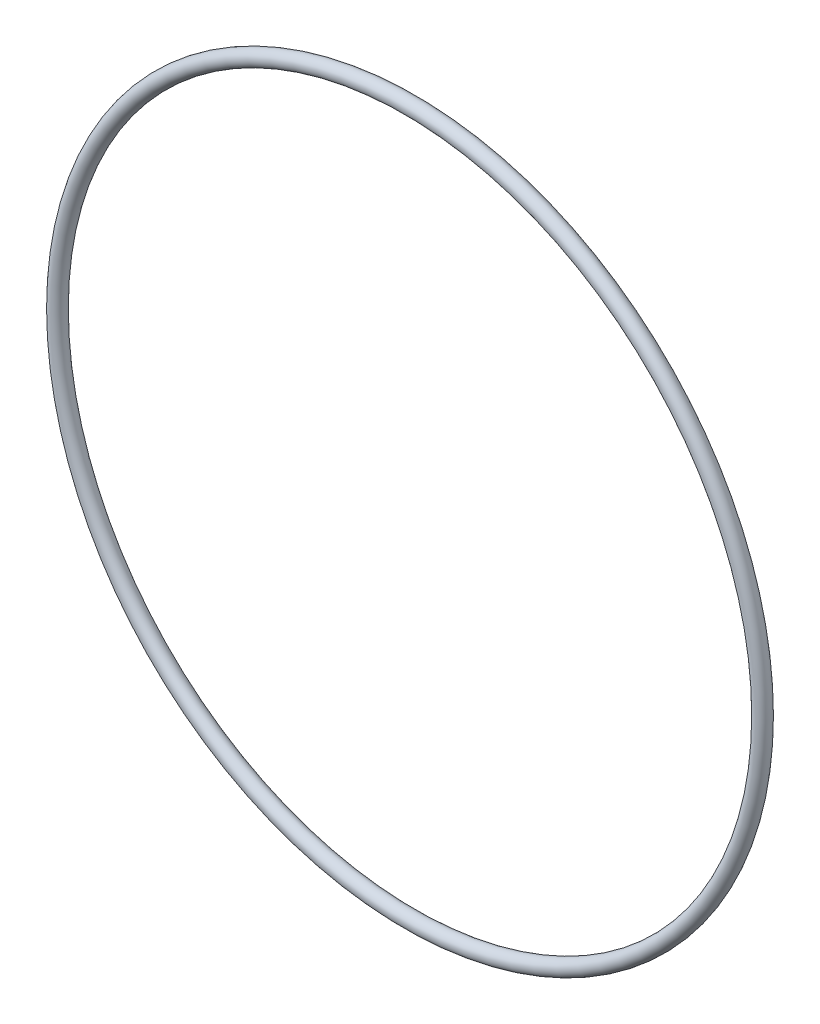
ISO-10303-21;
HEADER;
FILE_DESCRIPTION(('STEP AP214'),'2;1');
FILE_NAME('part.step','',(''),(''),'','','');
FILE_SCHEMA(('AUTOMOTIVE_DESIGN { 1 0 10303 214 1 1 1 1 }'));
ENDSEC;
DATA;
#1=APPLICATION_CONTEXT('core data for automotive mechanical design processes');
#2=APPLICATION_PROTOCOL_DEFINITION('international standard','automotive_design',2000,#1);
#3=PRODUCT_CONTEXT('',#1,'mechanical');
#4=PRODUCT('Part','Part','',(#3));
#5=PRODUCT_RELATED_PRODUCT_CATEGORY('part','',(#4));
#6=PRODUCT_DEFINITION_FORMATION('','',#4);
#7=PRODUCT_DEFINITION_CONTEXT('part definition',#1,'design');
#8=PRODUCT_DEFINITION('design','',#6,#7);
#9=PRODUCT_DEFINITION_SHAPE('','',#8);
#10=(LENGTH_UNIT() NAMED_UNIT(*) SI_UNIT(.MILLI.,.METRE.));
#11=(NAMED_UNIT(*) PLANE_ANGLE_UNIT() SI_UNIT($,.RADIAN.));
#12=(NAMED_UNIT(*) SI_UNIT($,.STERADIAN.) SOLID_ANGLE_UNIT());
#13=UNCERTAINTY_MEASURE_WITH_UNIT(LENGTH_MEASURE(1.E-05),#10,'distance_accuracy_value','');
#14=(GEOMETRIC_REPRESENTATION_CONTEXT(3) GLOBAL_UNCERTAINTY_ASSIGNED_CONTEXT((#13)) GLOBAL_UNIT_ASSIGNED_CONTEXT((#10,
#11,#12)) REPRESENTATION_CONTEXT('',''));
#15=CARTESIAN_POINT('',(0.,0.,0.));
#16=DIRECTION('',(0.,0.,1.));
#17=DIRECTION('',(1.,0.,0.));
#18=AXIS2_PLACEMENT_3D('',#15,#16,#17);
#19=CARTESIAN_POINT('',(0.,0.,0.));
#20=DIRECTION('',(0.,0.,-1.));
#21=DIRECTION('',(-1.,0.,0.));
#22=AXIS2_PLACEMENT_3D('',#19,#20,#21);
#23=TOROIDAL_SURFACE('',#22,68.75,1.5);
#24=CARTESIAN_POINT('',(-70.25,0.,0.));
#25=VERTEX_POINT('',#24);
#26=VERTEX_LOOP('',#25);
#27=FACE_BOUND('',#26,.T.);
#28=ADVANCED_FACE('F39',(#27),#23,.T.);
#29=CLOSED_SHELL('',(#28));
#30=MANIFOLD_SOLID_BREP('B2',#29);
#31=ADVANCED_BREP_SHAPE_REPRESENTATION('',(#18,#30),#14);
#32=SHAPE_DEFINITION_REPRESENTATION(#9,#31);
ENDSEC;
END-ISO-10303-21;
